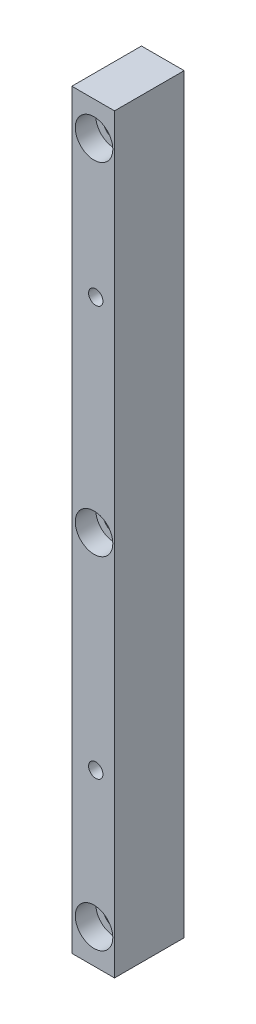
ISO-10303-21;
HEADER;
FILE_DESCRIPTION(('STEP AP214'),'2;1');
FILE_NAME('part.step','',(''),(''),'','','');
FILE_SCHEMA(('AUTOMOTIVE_DESIGN { 1 0 10303 214 1 1 1 1 }'));
ENDSEC;
DATA;
#1=APPLICATION_CONTEXT('core data for automotive mechanical design processes');
#2=APPLICATION_PROTOCOL_DEFINITION('international standard','automotive_design',2000,#1);
#3=PRODUCT_CONTEXT('',#1,'mechanical');
#4=PRODUCT('Part','Part','',(#3));
#5=PRODUCT_RELATED_PRODUCT_CATEGORY('part','',(#4));
#6=PRODUCT_DEFINITION_FORMATION('','',#4);
#7=PRODUCT_DEFINITION_CONTEXT('part definition',#1,'design');
#8=PRODUCT_DEFINITION('design','',#6,#7);
#9=PRODUCT_DEFINITION_SHAPE('','',#8);
#10=(LENGTH_UNIT() NAMED_UNIT(*) SI_UNIT(.MILLI.,.METRE.));
#11=(NAMED_UNIT(*) PLANE_ANGLE_UNIT() SI_UNIT($,.RADIAN.));
#12=(NAMED_UNIT(*) SI_UNIT($,.STERADIAN.) SOLID_ANGLE_UNIT());
#13=UNCERTAINTY_MEASURE_WITH_UNIT(LENGTH_MEASURE(1.E-05),#10,'distance_accuracy_value','');
#14=(GEOMETRIC_REPRESENTATION_CONTEXT(3) GLOBAL_UNCERTAINTY_ASSIGNED_CONTEXT((#13)) GLOBAL_UNIT_ASSIGNED_CONTEXT((#10,
#11,#12)) REPRESENTATION_CONTEXT('',''));
#15=CARTESIAN_POINT('',(0.,0.,0.));
#16=DIRECTION('',(0.,0.,1.));
#17=DIRECTION('',(1.,0.,0.));
#18=AXIS2_PLACEMENT_3D('',#15,#16,#17);
#19=CARTESIAN_POINT('',(-117.,-110.,20.3999999999999));
#20=DIRECTION('',(1.,0.,0.));
#21=DIRECTION('',(0.,0.,-1.));
#22=AXIS2_PLACEMENT_3D('',#19,#20,#21);
#23=PLANE('',#22);
#24=DIRECTION('',(0.,-1.,0.));
#25=VECTOR('',#24,1.);
#26=CARTESIAN_POINT('',(-117.,-110.,0.));
#27=LINE('',#26,#25);
#28=CARTESIAN_POINT('',(-117.,110.,0.));
#29=VERTEX_POINT('',#28);
#30=CARTESIAN_POINT('',(-117.,-110.,0.));
#31=VERTEX_POINT('',#30);
#32=EDGE_CURVE('E97',#29,#31,#27,.T.);
#33=ORIENTED_EDGE('',*,*,#32,.T.);
#34=DIRECTION('',(0.,0.,-1.));
#35=VECTOR('',#34,1.);
#36=CARTESIAN_POINT('',(-117.,-110.,20.3999999999999));
#37=LINE('',#36,#35);
#38=CARTESIAN_POINT('',(-117.,-110.,20.3999999999999));
#39=VERTEX_POINT('',#38);
#40=EDGE_CURVE('E11',#39,#31,#37,.T.);
#41=ORIENTED_EDGE('',*,*,#40,.F.);
#42=DIRECTION('',(0.,-1.,0.));
#43=VECTOR('',#42,1.);
#44=CARTESIAN_POINT('',(-117.,-110.,20.3999999999999));
#45=LINE('',#44,#43);
#46=CARTESIAN_POINT('',(-117.,110.,20.3999999999999));
#47=VERTEX_POINT('',#46);
#48=EDGE_CURVE('E85',#47,#39,#45,.T.);
#49=ORIENTED_EDGE('',*,*,#48,.F.);
#50=DIRECTION('',(0.,0.,-1.));
#51=VECTOR('',#50,1.);
#52=CARTESIAN_POINT('',(-117.,110.,20.3999999999999));
#53=LINE('',#52,#51);
#54=EDGE_CURVE('E93',#47,#29,#53,.T.);
#55=ORIENTED_EDGE('',*,*,#54,.T.);
#56=EDGE_LOOP('',(#33,#41,#49,#55));
#57=FACE_BOUND('',#56,.T.);
#58=ADVANCED_FACE('F34',(#57),#23,.F.);
#59=CARTESIAN_POINT('',(-117.,-110.,20.3999999999999));
#60=DIRECTION('',(0.,1.,0.));
#61=DIRECTION('',(0.,0.,1.));
#62=AXIS2_PLACEMENT_3D('',#59,#60,#61);
#63=PLANE('',#62);
#64=DIRECTION('',(1.,0.,0.));
#65=VECTOR('',#64,1.);
#66=CARTESIAN_POINT('',(-117.,-110.,0.));
#67=LINE('',#66,#65);
#68=CARTESIAN_POINT('',(-104.5,-110.,0.));
#69=VERTEX_POINT('',#68);
#70=EDGE_CURVE('E89',#31,#69,#67,.T.);
#71=ORIENTED_EDGE('',*,*,#70,.T.);
#72=DIRECTION('',(0.,0.,-1.));
#73=VECTOR('',#72,1.);
#74=CARTESIAN_POINT('',(-104.5,-110.,20.3999999999999));
#75=LINE('',#74,#73);
#76=CARTESIAN_POINT('',(-104.5,-110.,20.3999999999999));
#77=VERTEX_POINT('',#76);
#78=EDGE_CURVE('E42',#77,#69,#75,.T.);
#79=ORIENTED_EDGE('',*,*,#78,.F.);
#80=DIRECTION('',(1.,0.,0.));
#81=VECTOR('',#80,1.);
#82=CARTESIAN_POINT('',(-117.,-110.,20.3999999999999));
#83=LINE('',#82,#81);
#84=EDGE_CURVE('E80',#39,#77,#83,.T.);
#85=ORIENTED_EDGE('',*,*,#84,.F.);
#86=ORIENTED_EDGE('',*,*,#40,.T.);
#87=EDGE_LOOP('',(#71,#79,#85,#86));
#88=FACE_BOUND('',#87,.T.);
#89=ADVANCED_FACE('F88',(#88),#63,.F.);
#90=CARTESIAN_POINT('',(-104.5,-110.,20.3999999999999));
#91=DIRECTION('',(-1.,0.,0.));
#92=DIRECTION('',(0.,0.,1.));
#93=AXIS2_PLACEMENT_3D('',#90,#91,#92);
#94=PLANE('',#93);
#95=DIRECTION('',(0.,1.,0.));
#96=VECTOR('',#95,1.);
#97=CARTESIAN_POINT('',(-104.5,-110.,0.));
#98=LINE('',#97,#96);
#99=CARTESIAN_POINT('',(-104.5,110.,0.));
#100=VERTEX_POINT('',#99);
#101=EDGE_CURVE('E67',#69,#100,#98,.T.);
#102=ORIENTED_EDGE('',*,*,#101,.T.);
#103=DIRECTION('',(0.,0.,-1.));
#104=VECTOR('',#103,1.);
#105=CARTESIAN_POINT('',(-104.5,110.,20.3999999999999));
#106=LINE('',#105,#104);
#107=CARTESIAN_POINT('',(-104.5,110.,20.3999999999999));
#108=VERTEX_POINT('',#107);
#109=EDGE_CURVE('E90',#108,#100,#106,.T.);
#110=ORIENTED_EDGE('',*,*,#109,.F.);
#111=DIRECTION('',(0.,1.,0.));
#112=VECTOR('',#111,1.);
#113=CARTESIAN_POINT('',(-104.5,-110.,20.3999999999999));
#114=LINE('',#113,#112);
#115=EDGE_CURVE('E83',#77,#108,#114,.T.);
#116=ORIENTED_EDGE('',*,*,#115,.F.);
#117=ORIENTED_EDGE('',*,*,#78,.T.);
#118=EDGE_LOOP('',(#102,#110,#116,#117));
#119=FACE_BOUND('',#118,.T.);
#120=ADVANCED_FACE('F91',(#119),#94,.F.);
#121=CARTESIAN_POINT('',(-117.,110.,20.3999999999999));
#122=DIRECTION('',(0.,-1.,0.));
#123=DIRECTION('',(0.,0.,-1.));
#124=AXIS2_PLACEMENT_3D('',#121,#122,#123);
#125=PLANE('',#124);
#126=DIRECTION('',(-1.,0.,0.));
#127=VECTOR('',#126,1.);
#128=CARTESIAN_POINT('',(-117.,110.,0.));
#129=LINE('',#128,#127);
#130=EDGE_CURVE('E73',#100,#29,#129,.T.);
#131=ORIENTED_EDGE('',*,*,#130,.T.);
#132=ORIENTED_EDGE('',*,*,#54,.F.);
#133=DIRECTION('',(-1.,0.,0.));
#134=VECTOR('',#133,1.);
#135=CARTESIAN_POINT('',(-117.,110.,20.3999999999999));
#136=LINE('',#135,#134);
#137=EDGE_CURVE('E50',#108,#47,#136,.T.);
#138=ORIENTED_EDGE('',*,*,#137,.F.);
#139=ORIENTED_EDGE('',*,*,#109,.T.);
#140=EDGE_LOOP('',(#131,#132,#138,#139));
#141=FACE_BOUND('',#140,.T.);
#142=ADVANCED_FACE('F105',(#141),#125,.F.);
#143=CARTESIAN_POINT('',(0.,0.,20.3999999999999));
#144=DIRECTION('',(0.,0.,-1.));
#145=DIRECTION('',(-1.,0.,0.));
#146=AXIS2_PLACEMENT_3D('',#143,#144,#145);
#147=PLANE('',#146);
#148=CARTESIAN_POINT('',(-110.,60.,20.3999999999999));
#149=DIRECTION('',(0.,0.,1.));
#150=DIRECTION('',(1.,0.,0.));
#151=AXIS2_PLACEMENT_3D('',#148,#149,#150);
#152=CIRCLE('',#151,2.1);
#153=CARTESIAN_POINT('',(-107.9,60.,20.3999999999999));
#154=VERTEX_POINT('',#153);
#155=EDGE_CURVE('E155',#154,#154,#152,.T.);
#156=ORIENTED_EDGE('',*,*,#155,.F.);
#157=EDGE_LOOP('',(#156));
#158=FACE_BOUND('',#157,.T.);
#159=CARTESIAN_POINT('',(-110.,-60.,20.3999999999999));
#160=DIRECTION('',(0.,0.,1.));
#161=DIRECTION('',(1.,0.,0.));
#162=AXIS2_PLACEMENT_3D('',#159,#160,#161);
#163=CIRCLE('',#162,2.1);
#164=CARTESIAN_POINT('',(-107.9,-60.,20.3999999999999));
#165=VERTEX_POINT('',#164);
#166=EDGE_CURVE('E149',#165,#165,#163,.T.);
#167=ORIENTED_EDGE('',*,*,#166,.F.);
#168=EDGE_LOOP('',(#167));
#169=FACE_BOUND('',#168,.T.);
#170=CARTESIAN_POINT('',(-110.5,100.,20.3999999999999));
#171=DIRECTION('',(0.,0.,1.));
#172=DIRECTION('',(1.,0.,0.));
#173=AXIS2_PLACEMENT_3D('',#170,#171,#172);
#174=CIRCLE('',#173,5.49999999999999);
#175=CARTESIAN_POINT('',(-105.,100.,20.3999999999999));
#176=VERTEX_POINT('',#175);
#177=EDGE_CURVE('E143',#176,#176,#174,.T.);
#178=ORIENTED_EDGE('',*,*,#177,.F.);
#179=EDGE_LOOP('',(#178));
#180=FACE_BOUND('',#179,.T.);
#181=CARTESIAN_POINT('',(-110.5,0.,20.3999999999999));
#182=DIRECTION('',(0.,0.,1.));
#183=DIRECTION('',(1.,0.,0.));
#184=AXIS2_PLACEMENT_3D('',#181,#182,#183);
#185=CIRCLE('',#184,5.49999999999999);
#186=CARTESIAN_POINT('',(-105.,0.,20.3999999999999));
#187=VERTEX_POINT('',#186);
#188=EDGE_CURVE('E131',#187,#187,#185,.T.);
#189=ORIENTED_EDGE('',*,*,#188,.F.);
#190=EDGE_LOOP('',(#189));
#191=FACE_BOUND('',#190,.T.);
#192=CARTESIAN_POINT('',(-110.5,-100.,20.3999999999999));
#193=DIRECTION('',(0.,0.,1.));
#194=DIRECTION('',(1.,0.,0.));
#195=AXIS2_PLACEMENT_3D('',#192,#193,#194);
#196=CIRCLE('',#195,5.49999999999999);
#197=CARTESIAN_POINT('',(-105.,-100.,20.3999999999999));
#198=VERTEX_POINT('',#197);
#199=EDGE_CURVE('E119',#198,#198,#196,.T.);
#200=ORIENTED_EDGE('',*,*,#199,.F.);
#201=EDGE_LOOP('',(#200));
#202=FACE_BOUND('',#201,.T.);
#203=ORIENTED_EDGE('',*,*,#48,.T.);
#204=ORIENTED_EDGE('',*,*,#84,.T.);
#205=ORIENTED_EDGE('',*,*,#115,.T.);
#206=ORIENTED_EDGE('',*,*,#137,.T.);
#207=EDGE_LOOP('',(#203,#204,#205,#206));
#208=FACE_BOUND('',#207,.T.);
#209=ADVANCED_FACE('F81',(#158,#169,#180,#191,#202,#208),#147,.F.);
#210=CARTESIAN_POINT('',(0.,0.,0.));
#211=DIRECTION('',(0.,0.,-1.));
#212=DIRECTION('',(-1.,0.,0.));
#213=AXIS2_PLACEMENT_3D('',#210,#211,#212);
#214=PLANE('',#213);
#215=CARTESIAN_POINT('',(-110.,60.,0.));
#216=DIRECTION('',(0.,0.,1.));
#217=DIRECTION('',(1.,0.,0.));
#218=AXIS2_PLACEMENT_3D('',#215,#216,#217);
#219=CIRCLE('',#218,2.09999999999999);
#220=CARTESIAN_POINT('',(-107.9,60.,0.));
#221=VERTEX_POINT('',#220);
#222=EDGE_CURVE('E152',#221,#221,#219,.T.);
#223=ORIENTED_EDGE('',*,*,#222,.T.);
#224=EDGE_LOOP('',(#223));
#225=FACE_BOUND('',#224,.T.);
#226=CARTESIAN_POINT('',(-110.,-60.,0.));
#227=DIRECTION('',(0.,0.,1.));
#228=DIRECTION('',(1.,0.,0.));
#229=AXIS2_PLACEMENT_3D('',#226,#227,#228);
#230=CIRCLE('',#229,2.09999999999999);
#231=CARTESIAN_POINT('',(-107.9,-60.,0.));
#232=VERTEX_POINT('',#231);
#233=EDGE_CURVE('E146',#232,#232,#230,.T.);
#234=ORIENTED_EDGE('',*,*,#233,.T.);
#235=EDGE_LOOP('',(#234));
#236=FACE_BOUND('',#235,.T.);
#237=CARTESIAN_POINT('',(-110.5,100.,0.));
#238=DIRECTION('',(0.,0.,1.));
#239=DIRECTION('',(1.,0.,0.));
#240=AXIS2_PLACEMENT_3D('',#237,#238,#239);
#241=CIRCLE('',#240,3.3);
#242=CARTESIAN_POINT('',(-107.2,100.,0.));
#243=VERTEX_POINT('',#242);
#244=EDGE_CURVE('E134',#243,#243,#241,.T.);
#245=ORIENTED_EDGE('',*,*,#244,.T.);
#246=EDGE_LOOP('',(#245));
#247=FACE_BOUND('',#246,.T.);
#248=CARTESIAN_POINT('',(-110.5,0.,0.));
#249=DIRECTION('',(0.,0.,1.));
#250=DIRECTION('',(1.,0.,0.));
#251=AXIS2_PLACEMENT_3D('',#248,#249,#250);
#252=CIRCLE('',#251,3.3);
#253=CARTESIAN_POINT('',(-107.2,0.,0.));
#254=VERTEX_POINT('',#253);
#255=EDGE_CURVE('E122',#254,#254,#252,.T.);
#256=ORIENTED_EDGE('',*,*,#255,.T.);
#257=EDGE_LOOP('',(#256));
#258=FACE_BOUND('',#257,.T.);
#259=CARTESIAN_POINT('',(-110.5,-100.,0.));
#260=DIRECTION('',(0.,0.,1.));
#261=DIRECTION('',(1.,0.,0.));
#262=AXIS2_PLACEMENT_3D('',#259,#260,#261);
#263=CIRCLE('',#262,3.3);
#264=CARTESIAN_POINT('',(-107.2,-100.,0.));
#265=VERTEX_POINT('',#264);
#266=EDGE_CURVE('E100',#265,#265,#263,.T.);
#267=ORIENTED_EDGE('',*,*,#266,.T.);
#268=EDGE_LOOP('',(#267));
#269=FACE_BOUND('',#268,.T.);
#270=ORIENTED_EDGE('',*,*,#32,.F.);
#271=ORIENTED_EDGE('',*,*,#130,.F.);
#272=ORIENTED_EDGE('',*,*,#101,.F.);
#273=ORIENTED_EDGE('',*,*,#70,.F.);
#274=EDGE_LOOP('',(#270,#271,#272,#273));
#275=FACE_BOUND('',#274,.T.);
#276=ADVANCED_FACE('F108',(#225,#236,#247,#258,#269,#275),#214,.T.);
#277=CARTESIAN_POINT('',(-110.5,-100.,20.3999999999999));
#278=DIRECTION('',(0.,0.,1.));
#279=DIRECTION('',(1.,0.,0.));
#280=AXIS2_PLACEMENT_3D('',#277,#278,#279);
#281=CYLINDRICAL_SURFACE('',#280,3.3);
#282=ORIENTED_EDGE('',*,*,#266,.F.);
#283=EDGE_LOOP('',(#282));
#284=FACE_BOUND('',#283,.T.);
#285=CARTESIAN_POINT('',(-110.5,-100.,14.3999999999999));
#286=DIRECTION('',(0.,0.,1.));
#287=DIRECTION('',(1.,0.,0.));
#288=AXIS2_PLACEMENT_3D('',#285,#286,#287);
#289=CIRCLE('',#288,3.3);
#290=CARTESIAN_POINT('',(-107.2,-100.,14.3999999999999));
#291=VERTEX_POINT('',#290);
#292=EDGE_CURVE('E113',#291,#291,#289,.T.);
#293=ORIENTED_EDGE('',*,*,#292,.T.);
#294=EDGE_LOOP('',(#293));
#295=FACE_BOUND('',#294,.T.);
#296=ADVANCED_FACE('F185',(#284,#295),#281,.F.);
#297=CARTESIAN_POINT('',(-107.2,-100.,14.3999999999999));
#298=DIRECTION('',(0.,0.,-1.));
#299=DIRECTION('',(-1.,0.,0.));
#300=AXIS2_PLACEMENT_3D('',#297,#298,#299);
#301=PLANE('',#300);
#302=ORIENTED_EDGE('',*,*,#292,.F.);
#303=EDGE_LOOP('',(#302));
#304=FACE_BOUND('',#303,.T.);
#305=CARTESIAN_POINT('',(-110.5,-100.,14.3999999999999));
#306=DIRECTION('',(0.,0.,1.));
#307=DIRECTION('',(1.,0.,0.));
#308=AXIS2_PLACEMENT_3D('',#305,#306,#307);
#309=CIRCLE('',#308,5.49999999999999);
#310=CARTESIAN_POINT('',(-105.,-100.,14.3999999999999));
#311=VERTEX_POINT('',#310);
#312=EDGE_CURVE('E116',#311,#311,#309,.T.);
#313=ORIENTED_EDGE('',*,*,#312,.T.);
#314=EDGE_LOOP('',(#313));
#315=FACE_BOUND('',#314,.T.);
#316=ADVANCED_FACE('F175',(#304,#315),#301,.F.);
#317=CARTESIAN_POINT('',(-110.5,-100.,20.3999999999999));
#318=DIRECTION('',(0.,0.,1.));
#319=DIRECTION('',(1.,0.,0.));
#320=AXIS2_PLACEMENT_3D('',#317,#318,#319);
#321=CYLINDRICAL_SURFACE('',#320,5.49999999999999);
#322=ORIENTED_EDGE('',*,*,#312,.F.);
#323=EDGE_LOOP('',(#322));
#324=FACE_BOUND('',#323,.T.);
#325=ORIENTED_EDGE('',*,*,#199,.T.);
#326=EDGE_LOOP('',(#325));
#327=FACE_BOUND('',#326,.T.);
#328=ADVANCED_FACE('F172',(#324,#327),#321,.F.);
#329=CARTESIAN_POINT('',(-110.5,0.,20.3999999999999));
#330=DIRECTION('',(0.,0.,1.));
#331=DIRECTION('',(1.,0.,0.));
#332=AXIS2_PLACEMENT_3D('',#329,#330,#331);
#333=CYLINDRICAL_SURFACE('',#332,3.3);
#334=ORIENTED_EDGE('',*,*,#255,.F.);
#335=EDGE_LOOP('',(#334));
#336=FACE_BOUND('',#335,.T.);
#337=CARTESIAN_POINT('',(-110.5,0.,14.3999999999999));
#338=DIRECTION('',(0.,0.,1.));
#339=DIRECTION('',(1.,0.,0.));
#340=AXIS2_PLACEMENT_3D('',#337,#338,#339);
#341=CIRCLE('',#340,3.3);
#342=CARTESIAN_POINT('',(-107.2,0.,14.3999999999999));
#343=VERTEX_POINT('',#342);
#344=EDGE_CURVE('E125',#343,#343,#341,.T.);
#345=ORIENTED_EDGE('',*,*,#344,.T.);
#346=EDGE_LOOP('',(#345));
#347=FACE_BOUND('',#346,.T.);
#348=ADVANCED_FACE('F174',(#336,#347),#333,.F.);
#349=CARTESIAN_POINT('',(-107.2,0.,14.3999999999999));
#350=DIRECTION('',(0.,0.,-1.));
#351=DIRECTION('',(-1.,0.,0.));
#352=AXIS2_PLACEMENT_3D('',#349,#350,#351);
#353=PLANE('',#352);
#354=ORIENTED_EDGE('',*,*,#344,.F.);
#355=EDGE_LOOP('',(#354));
#356=FACE_BOUND('',#355,.T.);
#357=CARTESIAN_POINT('',(-110.5,0.,14.3999999999999));
#358=DIRECTION('',(0.,0.,1.));
#359=DIRECTION('',(1.,0.,0.));
#360=AXIS2_PLACEMENT_3D('',#357,#358,#359);
#361=CIRCLE('',#360,5.49999999999999);
#362=CARTESIAN_POINT('',(-105.,0.,14.3999999999999));
#363=VERTEX_POINT('',#362);
#364=EDGE_CURVE('E128',#363,#363,#361,.T.);
#365=ORIENTED_EDGE('',*,*,#364,.T.);
#366=EDGE_LOOP('',(#365));
#367=FACE_BOUND('',#366,.T.);
#368=ADVANCED_FACE('F182',(#356,#367),#353,.F.);
#369=CARTESIAN_POINT('',(-110.5,0.,20.3999999999999));
#370=DIRECTION('',(0.,0.,1.));
#371=DIRECTION('',(1.,0.,0.));
#372=AXIS2_PLACEMENT_3D('',#369,#370,#371);
#373=CYLINDRICAL_SURFACE('',#372,5.49999999999999);
#374=ORIENTED_EDGE('',*,*,#364,.F.);
#375=EDGE_LOOP('',(#374));
#376=FACE_BOUND('',#375,.T.);
#377=ORIENTED_EDGE('',*,*,#188,.T.);
#378=EDGE_LOOP('',(#377));
#379=FACE_BOUND('',#378,.T.);
#380=ADVANCED_FACE('F238',(#376,#379),#373,.F.);
#381=CARTESIAN_POINT('',(-110.5,100.,20.3999999999999));
#382=DIRECTION('',(0.,0.,1.));
#383=DIRECTION('',(1.,0.,0.));
#384=AXIS2_PLACEMENT_3D('',#381,#382,#383);
#385=CYLINDRICAL_SURFACE('',#384,3.3);
#386=ORIENTED_EDGE('',*,*,#244,.F.);
#387=EDGE_LOOP('',(#386));
#388=FACE_BOUND('',#387,.T.);
#389=CARTESIAN_POINT('',(-110.5,100.,14.3999999999999));
#390=DIRECTION('',(0.,0.,1.));
#391=DIRECTION('',(1.,0.,0.));
#392=AXIS2_PLACEMENT_3D('',#389,#390,#391);
#393=CIRCLE('',#392,3.3);
#394=CARTESIAN_POINT('',(-107.2,100.,14.3999999999999));
#395=VERTEX_POINT('',#394);
#396=EDGE_CURVE('E137',#395,#395,#393,.T.);
#397=ORIENTED_EDGE('',*,*,#396,.T.);
#398=EDGE_LOOP('',(#397));
#399=FACE_BOUND('',#398,.T.);
#400=ADVANCED_FACE('F248',(#388,#399),#385,.F.);
#401=CARTESIAN_POINT('',(-107.2,100.,14.3999999999999));
#402=DIRECTION('',(0.,0.,-1.));
#403=DIRECTION('',(-1.,0.,0.));
#404=AXIS2_PLACEMENT_3D('',#401,#402,#403);
#405=PLANE('',#404);
#406=ORIENTED_EDGE('',*,*,#396,.F.);
#407=EDGE_LOOP('',(#406));
#408=FACE_BOUND('',#407,.T.);
#409=CARTESIAN_POINT('',(-110.5,100.,14.3999999999999));
#410=DIRECTION('',(0.,0.,1.));
#411=DIRECTION('',(1.,0.,0.));
#412=AXIS2_PLACEMENT_3D('',#409,#410,#411);
#413=CIRCLE('',#412,5.49999999999999);
#414=CARTESIAN_POINT('',(-105.,100.,14.3999999999999));
#415=VERTEX_POINT('',#414);
#416=EDGE_CURVE('E140',#415,#415,#413,.T.);
#417=ORIENTED_EDGE('',*,*,#416,.T.);
#418=EDGE_LOOP('',(#417));
#419=FACE_BOUND('',#418,.T.);
#420=ADVANCED_FACE('F258',(#408,#419),#405,.F.);
#421=CARTESIAN_POINT('',(-110.5,100.,20.3999999999999));
#422=DIRECTION('',(0.,0.,1.));
#423=DIRECTION('',(1.,0.,0.));
#424=AXIS2_PLACEMENT_3D('',#421,#422,#423);
#425=CYLINDRICAL_SURFACE('',#424,5.49999999999999);
#426=ORIENTED_EDGE('',*,*,#416,.F.);
#427=EDGE_LOOP('',(#426));
#428=FACE_BOUND('',#427,.T.);
#429=ORIENTED_EDGE('',*,*,#177,.T.);
#430=EDGE_LOOP('',(#429));
#431=FACE_BOUND('',#430,.T.);
#432=ADVANCED_FACE('F268',(#428,#431),#425,.F.);
#433=CARTESIAN_POINT('',(-110.,-60.,20.3999999999999));
#434=DIRECTION('',(0.,0.,1.));
#435=DIRECTION('',(1.,0.,0.));
#436=AXIS2_PLACEMENT_3D('',#433,#434,#435);
#437=CYLINDRICAL_SURFACE('',#436,2.1);
#438=ORIENTED_EDGE('',*,*,#233,.F.);
#439=EDGE_LOOP('',(#438));
#440=FACE_BOUND('',#439,.T.);
#441=ORIENTED_EDGE('',*,*,#166,.T.);
#442=EDGE_LOOP('',(#441));
#443=FACE_BOUND('',#442,.T.);
#444=ADVANCED_FACE('F278',(#440,#443),#437,.F.);
#445=CARTESIAN_POINT('',(-110.,60.,20.3999999999999));
#446=DIRECTION('',(0.,0.,1.));
#447=DIRECTION('',(1.,0.,0.));
#448=AXIS2_PLACEMENT_3D('',#445,#446,#447);
#449=CYLINDRICAL_SURFACE('',#448,2.1);
#450=ORIENTED_EDGE('',*,*,#222,.F.);
#451=EDGE_LOOP('',(#450));
#452=FACE_BOUND('',#451,.T.);
#453=ORIENTED_EDGE('',*,*,#155,.T.);
#454=EDGE_LOOP('',(#453));
#455=FACE_BOUND('',#454,.T.);
#456=ADVANCED_FACE('F159',(#452,#455),#449,.F.);
#457=CLOSED_SHELL('',(#58,#89,#120,#142,#209,#276,#296,#316,#328,#348,#368,#380,#400,#420,#432,
#444,#456));
#458=MANIFOLD_SOLID_BREP('B2',#457);
#459=ADVANCED_BREP_SHAPE_REPRESENTATION('',(#18,#458),#14);
#460=SHAPE_DEFINITION_REPRESENTATION(#9,#459);
ENDSEC;
END-ISO-10303-21;
